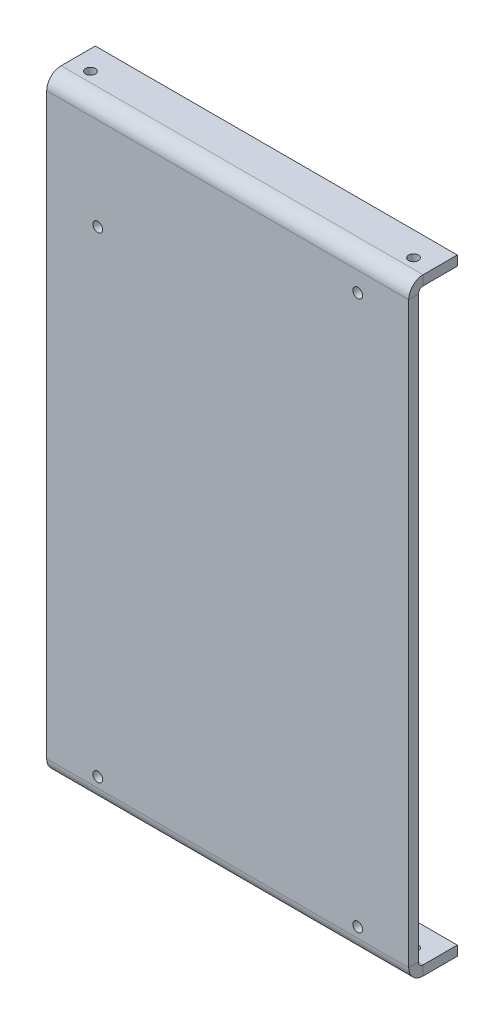
ISO-10303-21;
HEADER;
FILE_DESCRIPTION(('STEP AP214'),'2;1');
FILE_NAME('part.step','',(''),(''),'','','');
FILE_SCHEMA(('AUTOMOTIVE_DESIGN { 1 0 10303 214 1 1 1 1 }'));
ENDSEC;
DATA;
#1=APPLICATION_CONTEXT('core data for automotive mechanical design processes');
#2=APPLICATION_PROTOCOL_DEFINITION('international standard','automotive_design',2000,#1);
#3=PRODUCT_CONTEXT('',#1,'mechanical');
#4=PRODUCT('Part','Part','',(#3));
#5=PRODUCT_RELATED_PRODUCT_CATEGORY('part','',(#4));
#6=PRODUCT_DEFINITION_FORMATION('','',#4);
#7=PRODUCT_DEFINITION_CONTEXT('part definition',#1,'design');
#8=PRODUCT_DEFINITION('design','',#6,#7);
#9=PRODUCT_DEFINITION_SHAPE('','',#8);
#10=(LENGTH_UNIT() NAMED_UNIT(*) SI_UNIT(.MILLI.,.METRE.));
#11=(NAMED_UNIT(*) PLANE_ANGLE_UNIT() SI_UNIT($,.RADIAN.));
#12=(NAMED_UNIT(*) SI_UNIT($,.STERADIAN.) SOLID_ANGLE_UNIT());
#13=UNCERTAINTY_MEASURE_WITH_UNIT(LENGTH_MEASURE(1.E-05),#10,'distance_accuracy_value','');
#14=(GEOMETRIC_REPRESENTATION_CONTEXT(3) GLOBAL_UNCERTAINTY_ASSIGNED_CONTEXT((#13)) GLOBAL_UNIT_ASSIGNED_CONTEXT((#10,
#11,#12)) REPRESENTATION_CONTEXT('',''));
#15=CARTESIAN_POINT('',(0.,0.,0.));
#16=DIRECTION('',(0.,0.,1.));
#17=DIRECTION('',(1.,0.,0.));
#18=AXIS2_PLACEMENT_3D('',#15,#16,#17);
#19=CARTESIAN_POINT('',(0.,0.,-2.));
#20=DIRECTION('',(0.,0.,1.));
#21=DIRECTION('',(1.,0.,0.));
#22=AXIS2_PLACEMENT_3D('',#19,#20,#21);
#23=PLANE('',#22);
#24=CARTESIAN_POINT('',(-53.5,-15.,-2.));
#25=DIRECTION('',(0.,0.,1.));
#26=DIRECTION('',(1.,0.,0.));
#27=AXIS2_PLACEMENT_3D('',#24,#25,#26);
#28=CIRCLE('',#27,1.);
#29=CARTESIAN_POINT('',(-52.5,-15.,-2.));
#30=VERTEX_POINT('',#29);
#31=EDGE_CURVE('E284',#30,#30,#28,.T.);
#32=ORIENTED_EDGE('',*,*,#31,.T.);
#33=EDGE_LOOP('',(#32));
#34=FACE_BOUND('',#33,.T.);
#35=CARTESIAN_POINT('',(-53.5,-113.,-2.));
#36=DIRECTION('',(0.,0.,1.));
#37=DIRECTION('',(1.,0.,0.));
#38=AXIS2_PLACEMENT_3D('',#35,#36,#37);
#39=CIRCLE('',#38,0.999999999999998);
#40=CARTESIAN_POINT('',(-52.5,-113.,-2.));
#41=VERTEX_POINT('',#40);
#42=EDGE_CURVE('E293',#41,#41,#39,.T.);
#43=ORIENTED_EDGE('',*,*,#42,.T.);
#44=EDGE_LOOP('',(#43));
#45=FACE_BOUND('',#44,.T.);
#46=CARTESIAN_POINT('',(0.,-113.,-2.));
#47=DIRECTION('',(0.,0.,1.));
#48=DIRECTION('',(1.,0.,0.));
#49=AXIS2_PLACEMENT_3D('',#46,#47,#48);
#50=CIRCLE('',#49,0.999999999999998);
#51=CARTESIAN_POINT('',(0.999999999999998,-113.,-2.));
#52=VERTEX_POINT('',#51);
#53=EDGE_CURVE('E300',#52,#52,#50,.T.);
#54=ORIENTED_EDGE('',*,*,#53,.T.);
#55=EDGE_LOOP('',(#54));
#56=FACE_BOUND('',#55,.T.);
#57=CARTESIAN_POINT('',(0.,0.,-2.));
#58=DIRECTION('',(0.,0.,1.));
#59=DIRECTION('',(1.,0.,0.));
#60=AXIS2_PLACEMENT_3D('',#57,#58,#59);
#61=CIRCLE('',#60,1.);
#62=CARTESIAN_POINT('',(1.,0.,-2.));
#63=VERTEX_POINT('',#62);
#64=EDGE_CURVE('E303',#63,#63,#61,.T.);
#65=ORIENTED_EDGE('',*,*,#64,.T.);
#66=EDGE_LOOP('',(#65));
#67=FACE_BOUND('',#66,.T.);
#68=DIRECTION('',(1.,0.,0.));
#69=VECTOR('',#68,1.);
#70=CARTESIAN_POINT('',(10.5,4.03479999999999,-2.));
#71=LINE('',#70,#69);
#72=CARTESIAN_POINT('',(10.5,4.03479999999999,-2.));
#73=VERTEX_POINT('',#72);
#74=CARTESIAN_POINT('',(-64.,4.03479999999999,-2.00000000000001));
#75=VERTEX_POINT('',#74);
#76=EDGE_CURVE('E226',#73,#75,#71,.F.);
#77=ORIENTED_EDGE('',*,*,#76,.F.);
#78=DIRECTION('',(0.,1.,0.));
#79=VECTOR('',#78,1.);
#80=CARTESIAN_POINT('',(10.5,-118.,-2.));
#81=LINE('',#80,#79);
#82=CARTESIAN_POINT('',(10.5,-115.0348,-2.00000000000001));
#83=VERTEX_POINT('',#82);
#84=EDGE_CURVE('E95',#83,#73,#81,.T.);
#85=ORIENTED_EDGE('',*,*,#84,.F.);
#86=DIRECTION('',(-1.,0.,0.));
#87=VECTOR('',#86,1.);
#88=CARTESIAN_POINT('',(-64.,-115.0348,-2.00000000000001));
#89=LINE('',#88,#87);
#90=CARTESIAN_POINT('',(-64.,-115.0348,-2.00000000000001));
#91=VERTEX_POINT('',#90);
#92=EDGE_CURVE('E277',#91,#83,#89,.F.);
#93=ORIENTED_EDGE('',*,*,#92,.F.);
#94=DIRECTION('',(0.,-1.,0.));
#95=VECTOR('',#94,1.);
#96=CARTESIAN_POINT('',(-64.,-118.,-2.));
#97=LINE('',#96,#95);
#98=EDGE_CURVE('E13',#75,#91,#97,.T.);
#99=ORIENTED_EDGE('',*,*,#98,.F.);
#100=EDGE_LOOP('',(#77,#85,#93,#99));
#101=FACE_BOUND('',#100,.T.);
#102=ADVANCED_FACE('F84',(#34,#45,#56,#67,#101),#23,.F.);
#103=CARTESIAN_POINT('',(0.,0.,0.));
#104=DIRECTION('',(0.,0.,1.));
#105=DIRECTION('',(1.,0.,0.));
#106=AXIS2_PLACEMENT_3D('',#103,#104,#105);
#107=PLANE('',#106);
#108=CARTESIAN_POINT('',(-53.5,-15.,0.));
#109=DIRECTION('',(0.,0.,1.));
#110=DIRECTION('',(1.,0.,0.));
#111=AXIS2_PLACEMENT_3D('',#108,#109,#110);
#112=CIRCLE('',#111,1.);
#113=CARTESIAN_POINT('',(-52.5,-15.,0.));
#114=VERTEX_POINT('',#113);
#115=EDGE_CURVE('E285',#114,#114,#112,.T.);
#116=ORIENTED_EDGE('',*,*,#115,.F.);
#117=EDGE_LOOP('',(#116));
#118=FACE_BOUND('',#117,.T.);
#119=CARTESIAN_POINT('',(-53.5,-113.,0.));
#120=DIRECTION('',(0.,0.,1.));
#121=DIRECTION('',(1.,0.,0.));
#122=AXIS2_PLACEMENT_3D('',#119,#120,#121);
#123=CIRCLE('',#122,0.999999999999998);
#124=CARTESIAN_POINT('',(-52.5,-113.,0.));
#125=VERTEX_POINT('',#124);
#126=EDGE_CURVE('E289',#125,#125,#123,.T.);
#127=ORIENTED_EDGE('',*,*,#126,.F.);
#128=EDGE_LOOP('',(#127));
#129=FACE_BOUND('',#128,.T.);
#130=CARTESIAN_POINT('',(0.,-113.,0.));
#131=DIRECTION('',(0.,0.,1.));
#132=DIRECTION('',(1.,0.,0.));
#133=AXIS2_PLACEMENT_3D('',#130,#131,#132);
#134=CIRCLE('',#133,0.999999999999998);
#135=CARTESIAN_POINT('',(0.999999999999998,-113.,0.));
#136=VERTEX_POINT('',#135);
#137=EDGE_CURVE('E295',#136,#136,#134,.T.);
#138=ORIENTED_EDGE('',*,*,#137,.F.);
#139=EDGE_LOOP('',(#138));
#140=FACE_BOUND('',#139,.T.);
#141=CARTESIAN_POINT('',(0.,0.,0.));
#142=DIRECTION('',(0.,0.,1.));
#143=DIRECTION('',(1.,0.,0.));
#144=AXIS2_PLACEMENT_3D('',#141,#142,#143);
#145=CIRCLE('',#144,1.);
#146=CARTESIAN_POINT('',(1.,0.,0.));
#147=VERTEX_POINT('',#146);
#148=EDGE_CURVE('E297',#147,#147,#145,.T.);
#149=ORIENTED_EDGE('',*,*,#148,.F.);
#150=EDGE_LOOP('',(#149));
#151=FACE_BOUND('',#150,.T.);
#152=DIRECTION('',(0.,1.,0.));
#153=VECTOR('',#152,1.);
#154=CARTESIAN_POINT('',(10.5,-118.,0.));
#155=LINE('',#154,#153);
#156=CARTESIAN_POINT('',(10.5,-115.0348,0.));
#157=VERTEX_POINT('',#156);
#158=CARTESIAN_POINT('',(10.5,4.0348,0.));
#159=VERTEX_POINT('',#158);
#160=EDGE_CURVE('E306',#157,#159,#155,.T.);
#161=ORIENTED_EDGE('',*,*,#160,.T.);
#162=DIRECTION('',(1.,0.,0.));
#163=VECTOR('',#162,1.);
#164=CARTESIAN_POINT('',(10.5,4.0348,0.));
#165=LINE('',#164,#163);
#166=CARTESIAN_POINT('',(-64.,4.03479999999999,0.));
#167=VERTEX_POINT('',#166);
#168=EDGE_CURVE('E178',#159,#167,#165,.F.);
#169=ORIENTED_EDGE('',*,*,#168,.T.);
#170=DIRECTION('',(0.,-1.,0.));
#171=VECTOR('',#170,1.);
#172=CARTESIAN_POINT('',(-64.,-118.,0.));
#173=LINE('',#172,#171);
#174=CARTESIAN_POINT('',(-64.,-115.0348,0.));
#175=VERTEX_POINT('',#174);
#176=EDGE_CURVE('E309',#167,#175,#173,.T.);
#177=ORIENTED_EDGE('',*,*,#176,.T.);
#178=DIRECTION('',(-1.,0.,0.));
#179=VECTOR('',#178,1.);
#180=CARTESIAN_POINT('',(-64.,-115.0348,0.));
#181=LINE('',#180,#179);
#182=EDGE_CURVE('E261',#175,#157,#181,.F.);
#183=ORIENTED_EDGE('',*,*,#182,.T.);
#184=EDGE_LOOP('',(#161,#169,#177,#183));
#185=FACE_BOUND('',#184,.T.);
#186=ADVANCED_FACE('F376',(#118,#129,#140,#151,#185),#107,.T.);
#187=CARTESIAN_POINT('',(10.5,-118.,-2.));
#188=DIRECTION('',(1.,0.,0.));
#189=DIRECTION('',(0.,1.,0.));
#190=AXIS2_PLACEMENT_3D('',#187,#188,#189);
#191=PLANE('',#190);
#192=ORIENTED_EDGE('',*,*,#84,.T.);
#193=DIRECTION('',(0.,0.,1.));
#194=VECTOR('',#193,1.);
#195=CARTESIAN_POINT('',(10.5,4.03479999999999,-2.));
#196=LINE('',#195,#194);
#197=EDGE_CURVE('E221',#73,#159,#196,.T.);
#198=ORIENTED_EDGE('',*,*,#197,.T.);
#199=ORIENTED_EDGE('',*,*,#160,.F.);
#200=DIRECTION('',(0.,0.,1.));
#201=VECTOR('',#200,1.);
#202=CARTESIAN_POINT('',(10.5,-115.0348,-2.00000000000001));
#203=LINE('',#202,#201);
#204=EDGE_CURVE('E278',#83,#157,#203,.T.);
#205=ORIENTED_EDGE('',*,*,#204,.F.);
#206=EDGE_LOOP('',(#192,#198,#199,#205));
#207=FACE_BOUND('',#206,.T.);
#208=ADVANCED_FACE('F83',(#207),#191,.T.);
#209=CARTESIAN_POINT('',(-64.,-118.,-2.));
#210=DIRECTION('',(-1.,0.,0.));
#211=DIRECTION('',(0.,0.,1.));
#212=AXIS2_PLACEMENT_3D('',#209,#210,#211);
#213=PLANE('',#212);
#214=DIRECTION('',(0.,0.,1.));
#215=VECTOR('',#214,1.);
#216=CARTESIAN_POINT('',(-64.,4.03479999999999,-2.00000000000001));
#217=LINE('',#216,#215);
#218=EDGE_CURVE('E233',#75,#167,#217,.T.);
#219=ORIENTED_EDGE('',*,*,#218,.F.);
#220=ORIENTED_EDGE('',*,*,#98,.T.);
#221=DIRECTION('',(0.,0.,1.));
#222=VECTOR('',#221,1.);
#223=CARTESIAN_POINT('',(-64.,-115.0348,-2.00000000000001));
#224=LINE('',#223,#222);
#225=EDGE_CURVE('E268',#91,#175,#224,.T.);
#226=ORIENTED_EDGE('',*,*,#225,.T.);
#227=ORIENTED_EDGE('',*,*,#176,.F.);
#228=EDGE_LOOP('',(#219,#220,#226,#227));
#229=FACE_BOUND('',#228,.T.);
#230=ADVANCED_FACE('F363',(#229),#213,.T.);
#231=CARTESIAN_POINT('',(0.,0.,-2.));
#232=DIRECTION('',(0.,0.,1.));
#233=DIRECTION('',(1.,0.,0.));
#234=AXIS2_PLACEMENT_3D('',#231,#232,#233);
#235=CYLINDRICAL_SURFACE('',#234,1.);
#236=ORIENTED_EDGE('',*,*,#64,.F.);
#237=EDGE_LOOP('',(#236));
#238=FACE_BOUND('',#237,.T.);
#239=ORIENTED_EDGE('',*,*,#148,.T.);
#240=EDGE_LOOP('',(#239));
#241=FACE_BOUND('',#240,.T.);
#242=ADVANCED_FACE('F424',(#238,#241),#235,.F.);
#243=CARTESIAN_POINT('',(0.,-113.,-2.));
#244=DIRECTION('',(0.,0.,1.));
#245=DIRECTION('',(1.,0.,0.));
#246=AXIS2_PLACEMENT_3D('',#243,#244,#245);
#247=CYLINDRICAL_SURFACE('',#246,0.999999999999998);
#248=ORIENTED_EDGE('',*,*,#53,.F.);
#249=EDGE_LOOP('',(#248));
#250=FACE_BOUND('',#249,.T.);
#251=ORIENTED_EDGE('',*,*,#137,.T.);
#252=EDGE_LOOP('',(#251));
#253=FACE_BOUND('',#252,.T.);
#254=ADVANCED_FACE('F433',(#250,#253),#247,.F.);
#255=CARTESIAN_POINT('',(-53.5,-113.,-2.));
#256=DIRECTION('',(0.,0.,1.));
#257=DIRECTION('',(1.,0.,0.));
#258=AXIS2_PLACEMENT_3D('',#255,#256,#257);
#259=CYLINDRICAL_SURFACE('',#258,0.999999999999998);
#260=ORIENTED_EDGE('',*,*,#42,.F.);
#261=EDGE_LOOP('',(#260));
#262=FACE_BOUND('',#261,.T.);
#263=ORIENTED_EDGE('',*,*,#126,.T.);
#264=EDGE_LOOP('',(#263));
#265=FACE_BOUND('',#264,.T.);
#266=ADVANCED_FACE('F689',(#262,#265),#259,.F.);
#267=CARTESIAN_POINT('',(-53.5,-15.,-2.));
#268=DIRECTION('',(0.,0.,1.));
#269=DIRECTION('',(1.,0.,0.));
#270=AXIS2_PLACEMENT_3D('',#267,#268,#269);
#271=CYLINDRICAL_SURFACE('',#270,1.);
#272=ORIENTED_EDGE('',*,*,#31,.F.);
#273=EDGE_LOOP('',(#272));
#274=FACE_BOUND('',#273,.T.);
#275=ORIENTED_EDGE('',*,*,#115,.T.);
#276=EDGE_LOOP('',(#275));
#277=FACE_BOUND('',#276,.T.);
#278=ADVANCED_FACE('F456',(#274,#277),#271,.F.);
#279=CARTESIAN_POINT('',(10.5,-115.0348,-2.9652));
#280=DIRECTION('',(1.,0.,0.));
#281=DIRECTION('',(0.,0.,-1.));
#282=AXIS2_PLACEMENT_3D('',#279,#280,#281);
#283=PLANE('',#282);
#284=DIRECTION('',(0.,1.,0.));
#285=VECTOR('',#284,1.);
#286=CARTESIAN_POINT('',(10.5,-118.,-2.96519999999999));
#287=LINE('',#286,#285);
#288=CARTESIAN_POINT('',(10.5,-116.,-2.9652));
#289=VERTEX_POINT('',#288);
#290=CARTESIAN_POINT('',(10.5,-118.,-2.96519999999999));
#291=VERTEX_POINT('',#290);
#292=EDGE_CURVE('E231',#289,#291,#287,.F.);
#293=ORIENTED_EDGE('',*,*,#292,.F.);
#294=CARTESIAN_POINT('',(10.5,-115.0348,-2.9652));
#295=DIRECTION('',(-1.,0.,0.));
#296=DIRECTION('',(0.,0.,1.));
#297=AXIS2_PLACEMENT_3D('',#294,#295,#296);
#298=CIRCLE('',#297,0.965199999999999);
#299=EDGE_CURVE('E271',#83,#289,#298,.F.);
#300=ORIENTED_EDGE('',*,*,#299,.F.);
#301=ORIENTED_EDGE('',*,*,#204,.T.);
#302=CARTESIAN_POINT('',(10.5,-115.0348,-2.9652));
#303=DIRECTION('',(-1.,0.,0.));
#304=DIRECTION('',(0.,0.,1.));
#305=AXIS2_PLACEMENT_3D('',#302,#303,#304);
#306=CIRCLE('',#305,2.9652);
#307=EDGE_CURVE('E99',#157,#291,#306,.F.);
#308=ORIENTED_EDGE('',*,*,#307,.T.);
#309=EDGE_LOOP('',(#293,#300,#301,#308));
#310=FACE_BOUND('',#309,.T.);
#311=ADVANCED_FACE('F375',(#310),#283,.T.);
#312=CARTESIAN_POINT('',(-64.,-115.0348,-2.9652));
#313=DIRECTION('',(1.,0.,0.));
#314=DIRECTION('',(0.,0.,-1.));
#315=AXIS2_PLACEMENT_3D('',#312,#313,#314);
#316=PLANE('',#315);
#317=CARTESIAN_POINT('',(-64.,-115.0348,-2.9652));
#318=DIRECTION('',(-1.,0.,0.));
#319=DIRECTION('',(0.,0.,1.));
#320=AXIS2_PLACEMENT_3D('',#317,#318,#319);
#321=CIRCLE('',#320,0.965199999999999);
#322=CARTESIAN_POINT('',(-64.,-116.,-2.9652));
#323=VERTEX_POINT('',#322);
#324=EDGE_CURVE('E238',#323,#91,#321,.T.);
#325=ORIENTED_EDGE('',*,*,#324,.F.);
#326=DIRECTION('',(0.,1.,0.));
#327=VECTOR('',#326,1.);
#328=CARTESIAN_POINT('',(-64.,-116.,-2.9652));
#329=LINE('',#328,#327);
#330=CARTESIAN_POINT('',(-64.,-118.,-2.96519999999999));
#331=VERTEX_POINT('',#330);
#332=EDGE_CURVE('E259',#323,#331,#329,.F.);
#333=ORIENTED_EDGE('',*,*,#332,.T.);
#334=CARTESIAN_POINT('',(-64.,-115.0348,-2.9652));
#335=DIRECTION('',(-1.,0.,0.));
#336=DIRECTION('',(0.,0.,1.));
#337=AXIS2_PLACEMENT_3D('',#334,#335,#336);
#338=CIRCLE('',#337,2.9652);
#339=EDGE_CURVE('E270',#331,#175,#338,.T.);
#340=ORIENTED_EDGE('',*,*,#339,.T.);
#341=ORIENTED_EDGE('',*,*,#225,.F.);
#342=EDGE_LOOP('',(#325,#333,#340,#341));
#343=FACE_BOUND('',#342,.T.);
#344=ADVANCED_FACE('F378',(#343),#316,.F.);
#345=CARTESIAN_POINT('',(-64.,-115.0348,-2.9652));
#346=DIRECTION('',(-1.,0.,0.));
#347=DIRECTION('',(0.,-1.,0.));
#348=AXIS2_PLACEMENT_3D('',#345,#346,#347);
#349=CYLINDRICAL_SURFACE('',#348,2.9652);
#350=ORIENTED_EDGE('',*,*,#182,.F.);
#351=ORIENTED_EDGE('',*,*,#339,.F.);
#352=DIRECTION('',(-1.,0.,0.));
#353=VECTOR('',#352,1.);
#354=CARTESIAN_POINT('',(10.5,-118.,-2.96519999999999));
#355=LINE('',#354,#353);
#356=EDGE_CURVE('E257',#331,#291,#355,.F.);
#357=ORIENTED_EDGE('',*,*,#356,.T.);
#358=ORIENTED_EDGE('',*,*,#307,.F.);
#359=EDGE_LOOP('',(#350,#351,#357,#358));
#360=FACE_BOUND('',#359,.T.);
#361=ADVANCED_FACE('F380',(#360),#349,.T.);
#362=CARTESIAN_POINT('',(-64.,-115.0348,-2.9652));
#363=DIRECTION('',(-1.,0.,0.));
#364=DIRECTION('',(0.,-1.,0.));
#365=AXIS2_PLACEMENT_3D('',#362,#363,#364);
#366=CYLINDRICAL_SURFACE('',#365,0.965199999999999);
#367=ORIENTED_EDGE('',*,*,#92,.T.);
#368=ORIENTED_EDGE('',*,*,#299,.T.);
#369=DIRECTION('',(-1.,0.,0.));
#370=VECTOR('',#369,1.);
#371=CARTESIAN_POINT('',(10.5,-116.,-2.9652));
#372=LINE('',#371,#370);
#373=EDGE_CURVE('E262',#289,#323,#372,.T.);
#374=ORIENTED_EDGE('',*,*,#373,.T.);
#375=ORIENTED_EDGE('',*,*,#324,.T.);
#376=EDGE_LOOP('',(#367,#368,#374,#375));
#377=FACE_BOUND('',#376,.T.);
#378=ADVANCED_FACE('F370',(#377),#366,.F.);
#379=CARTESIAN_POINT('',(-64.,-118.,-10.));
#380=DIRECTION('',(1.,0.,0.));
#381=DIRECTION('',(0.,1.,0.));
#382=AXIS2_PLACEMENT_3D('',#379,#380,#381);
#383=PLANE('',#382);
#384=ORIENTED_EDGE('',*,*,#332,.F.);
#385=DIRECTION('',(0.,0.,1.));
#386=VECTOR('',#385,1.);
#387=CARTESIAN_POINT('',(-64.,-116.,-10.));
#388=LINE('',#387,#386);
#389=CARTESIAN_POINT('',(-64.,-116.,-10.));
#390=VERTEX_POINT('',#389);
#391=EDGE_CURVE('E251',#323,#390,#388,.F.);
#392=ORIENTED_EDGE('',*,*,#391,.T.);
#393=DIRECTION('',(0.,1.,0.));
#394=VECTOR('',#393,1.);
#395=CARTESIAN_POINT('',(-64.,-118.,-10.));
#396=LINE('',#395,#394);
#397=CARTESIAN_POINT('',(-64.,-118.,-10.));
#398=VERTEX_POINT('',#397);
#399=EDGE_CURVE('E232',#398,#390,#396,.T.);
#400=ORIENTED_EDGE('',*,*,#399,.F.);
#401=DIRECTION('',(0.,0.,-1.));
#402=VECTOR('',#401,1.);
#403=CARTESIAN_POINT('',(-64.,-118.,4.16377703008212E-13));
#404=LINE('',#403,#402);
#405=EDGE_CURVE('E250',#331,#398,#404,.T.);
#406=ORIENTED_EDGE('',*,*,#405,.F.);
#407=EDGE_LOOP('',(#384,#392,#400,#406));
#408=FACE_BOUND('',#407,.T.);
#409=ADVANCED_FACE('F388',(#408),#383,.F.);
#410=CARTESIAN_POINT('',(10.5,-118.,-1.99999999999999));
#411=DIRECTION('',(-1.,0.,0.));
#412=DIRECTION('',(0.,-1.,0.));
#413=AXIS2_PLACEMENT_3D('',#410,#411,#412);
#414=PLANE('',#413);
#415=ORIENTED_EDGE('',*,*,#292,.T.);
#416=DIRECTION('',(0.,0.,1.));
#417=VECTOR('',#416,1.);
#418=CARTESIAN_POINT('',(10.5,-118.,4.16377703008212E-13));
#419=LINE('',#418,#417);
#420=CARTESIAN_POINT('',(10.5,-118.,-10.));
#421=VERTEX_POINT('',#420);
#422=EDGE_CURVE('E245',#421,#291,#419,.T.);
#423=ORIENTED_EDGE('',*,*,#422,.F.);
#424=DIRECTION('',(0.,1.,0.));
#425=VECTOR('',#424,1.);
#426=CARTESIAN_POINT('',(10.5,-118.,-10.));
#427=LINE('',#426,#425);
#428=CARTESIAN_POINT('',(10.5,-116.,-10.));
#429=VERTEX_POINT('',#428);
#430=EDGE_CURVE('E237',#421,#429,#427,.T.);
#431=ORIENTED_EDGE('',*,*,#430,.T.);
#432=DIRECTION('',(0.,0.,-1.));
#433=VECTOR('',#432,1.);
#434=CARTESIAN_POINT('',(10.5,-116.,-2.));
#435=LINE('',#434,#433);
#436=EDGE_CURVE('E248',#429,#289,#435,.F.);
#437=ORIENTED_EDGE('',*,*,#436,.T.);
#438=EDGE_LOOP('',(#415,#423,#431,#437));
#439=FACE_BOUND('',#438,.T.);
#440=ADVANCED_FACE('F399',(#439),#414,.F.);
#441=CARTESIAN_POINT('',(0.,-118.,4.16377703008212E-13));
#442=DIRECTION('',(0.,1.,0.));
#443=DIRECTION('',(0.,0.,1.));
#444=AXIS2_PLACEMENT_3D('',#441,#442,#443);
#445=PLANE('',#444);
#446=CARTESIAN_POINT('',(-60.,-118.,-4.99999999999987));
#447=DIRECTION('',(0.,-1.,0.));
#448=DIRECTION('',(0.,0.,-1.));
#449=AXIS2_PLACEMENT_3D('',#446,#447,#448);
#450=CIRCLE('',#449,0.999999999999998);
#451=CARTESIAN_POINT('',(-60.,-118.,-5.99999999999987));
#452=VERTEX_POINT('',#451);
#453=EDGE_CURVE('E321',#452,#452,#450,.T.);
#454=ORIENTED_EDGE('',*,*,#453,.F.);
#455=EDGE_LOOP('',(#454));
#456=FACE_BOUND('',#455,.T.);
#457=CARTESIAN_POINT('',(6.5,-118.,-4.99999999999987));
#458=DIRECTION('',(0.,-1.,0.));
#459=DIRECTION('',(0.,0.,-1.));
#460=AXIS2_PLACEMENT_3D('',#457,#458,#459);
#461=CIRCLE('',#460,1.);
#462=CARTESIAN_POINT('',(6.5,-118.,-5.99999999999987));
#463=VERTEX_POINT('',#462);
#464=EDGE_CURVE('E329',#463,#463,#461,.T.);
#465=ORIENTED_EDGE('',*,*,#464,.F.);
#466=EDGE_LOOP('',(#465));
#467=FACE_BOUND('',#466,.T.);
#468=ORIENTED_EDGE('',*,*,#356,.F.);
#469=ORIENTED_EDGE('',*,*,#405,.T.);
#470=DIRECTION('',(1.,0.,0.));
#471=VECTOR('',#470,1.);
#472=CARTESIAN_POINT('',(0.,-118.,-10.));
#473=LINE('',#472,#471);
#474=EDGE_CURVE('E244',#398,#421,#473,.T.);
#475=ORIENTED_EDGE('',*,*,#474,.T.);
#476=ORIENTED_EDGE('',*,*,#422,.T.);
#477=EDGE_LOOP('',(#468,#469,#475,#476));
#478=FACE_BOUND('',#477,.T.);
#479=ADVANCED_FACE('F387',(#456,#467,#478),#445,.F.);
#480=CARTESIAN_POINT('',(0.,-116.,4.09394740330526E-13));
#481=DIRECTION('',(0.,1.,0.));
#482=DIRECTION('',(0.,0.,1.));
#483=AXIS2_PLACEMENT_3D('',#480,#481,#482);
#484=PLANE('',#483);
#485=CARTESIAN_POINT('',(-60.,-116.,-4.99999999999988));
#486=DIRECTION('',(0.,1.,0.));
#487=DIRECTION('',(0.,0.,1.));
#488=AXIS2_PLACEMENT_3D('',#485,#486,#487);
#489=CIRCLE('',#488,0.999999999999998);
#490=CARTESIAN_POINT('',(-60.,-116.,-3.99999999999988));
#491=VERTEX_POINT('',#490);
#492=EDGE_CURVE('E225',#491,#491,#489,.T.);
#493=ORIENTED_EDGE('',*,*,#492,.F.);
#494=EDGE_LOOP('',(#493));
#495=FACE_BOUND('',#494,.T.);
#496=CARTESIAN_POINT('',(6.5,-116.,-4.99999999999988));
#497=DIRECTION('',(0.,1.,0.));
#498=DIRECTION('',(0.,0.,1.));
#499=AXIS2_PLACEMENT_3D('',#496,#497,#498);
#500=CIRCLE('',#499,1.);
#501=CARTESIAN_POINT('',(6.5,-116.,-3.99999999999988));
#502=VERTEX_POINT('',#501);
#503=EDGE_CURVE('E320',#502,#502,#500,.T.);
#504=ORIENTED_EDGE('',*,*,#503,.F.);
#505=EDGE_LOOP('',(#504));
#506=FACE_BOUND('',#505,.T.);
#507=ORIENTED_EDGE('',*,*,#391,.F.);
#508=ORIENTED_EDGE('',*,*,#373,.F.);
#509=ORIENTED_EDGE('',*,*,#436,.F.);
#510=DIRECTION('',(-1.,0.,0.));
#511=VECTOR('',#510,1.);
#512=CARTESIAN_POINT('',(10.5,-116.,-10.));
#513=LINE('',#512,#511);
#514=EDGE_CURVE('E255',#390,#429,#513,.F.);
#515=ORIENTED_EDGE('',*,*,#514,.F.);
#516=EDGE_LOOP('',(#507,#508,#509,#515));
#517=FACE_BOUND('',#516,.T.);
#518=ADVANCED_FACE('F396',(#495,#506,#517),#484,.T.);
#519=CARTESIAN_POINT('',(10.5,-118.,-10.));
#520=DIRECTION('',(0.,0.,1.));
#521=DIRECTION('',(0.,-1.,0.));
#522=AXIS2_PLACEMENT_3D('',#519,#520,#521);
#523=PLANE('',#522);
#524=ORIENTED_EDGE('',*,*,#514,.T.);
#525=ORIENTED_EDGE('',*,*,#430,.F.);
#526=ORIENTED_EDGE('',*,*,#474,.F.);
#527=ORIENTED_EDGE('',*,*,#399,.T.);
#528=EDGE_LOOP('',(#524,#525,#526,#527));
#529=FACE_BOUND('',#528,.T.);
#530=ADVANCED_FACE('F393',(#529),#523,.F.);
#531=CARTESIAN_POINT('',(-64.,4.03479999999999,-2.96520000000001));
#532=DIRECTION('',(-1.,0.,0.));
#533=DIRECTION('',(0.,0.,1.));
#534=AXIS2_PLACEMENT_3D('',#531,#532,#533);
#535=PLANE('',#534);
#536=DIRECTION('',(0.,-1.,0.));
#537=VECTOR('',#536,1.);
#538=CARTESIAN_POINT('',(-64.,6.99999999999998,-2.96519999999999));
#539=LINE('',#538,#537);
#540=CARTESIAN_POINT('',(-64.,4.99999999999998,-2.9652));
#541=VERTEX_POINT('',#540);
#542=CARTESIAN_POINT('',(-64.,6.99999999999998,-2.9652));
#543=VERTEX_POINT('',#542);
#544=EDGE_CURVE('E217',#541,#543,#539,.F.);
#545=ORIENTED_EDGE('',*,*,#544,.F.);
#546=CARTESIAN_POINT('',(-64.,4.03479999999999,-2.96520000000001));
#547=DIRECTION('',(1.,0.,0.));
#548=DIRECTION('',(0.,0.,-1.));
#549=AXIS2_PLACEMENT_3D('',#546,#547,#548);
#550=CIRCLE('',#549,0.965199999999995);
#551=EDGE_CURVE('E181',#75,#541,#550,.F.);
#552=ORIENTED_EDGE('',*,*,#551,.F.);
#553=ORIENTED_EDGE('',*,*,#218,.T.);
#554=CARTESIAN_POINT('',(-64.,4.03479999999999,-2.96520000000001));
#555=DIRECTION('',(1.,0.,0.));
#556=DIRECTION('',(0.,0.,-1.));
#557=AXIS2_PLACEMENT_3D('',#554,#555,#556);
#558=CIRCLE('',#557,2.96519999999999);
#559=EDGE_CURVE('E108',#167,#543,#558,.F.);
#560=ORIENTED_EDGE('',*,*,#559,.T.);
#561=EDGE_LOOP('',(#545,#552,#553,#560));
#562=FACE_BOUND('',#561,.T.);
#563=ADVANCED_FACE('F357',(#562),#535,.T.);
#564=CARTESIAN_POINT('',(10.5,4.03479999999999,-2.96519999999999));
#565=DIRECTION('',(-1.,0.,0.));
#566=DIRECTION('',(0.,0.,1.));
#567=AXIS2_PLACEMENT_3D('',#564,#565,#566);
#568=PLANE('',#567);
#569=CARTESIAN_POINT('',(10.5,4.03479999999999,-2.96519999999999));
#570=DIRECTION('',(1.,0.,0.));
#571=DIRECTION('',(0.,0.,-1.));
#572=AXIS2_PLACEMENT_3D('',#569,#570,#571);
#573=CIRCLE('',#572,0.965199999999995);
#574=CARTESIAN_POINT('',(10.5,4.99999999999998,-2.96519999999999));
#575=VERTEX_POINT('',#574);
#576=EDGE_CURVE('E189',#575,#73,#573,.T.);
#577=ORIENTED_EDGE('',*,*,#576,.F.);
#578=DIRECTION('',(0.,-1.,0.));
#579=VECTOR('',#578,1.);
#580=CARTESIAN_POINT('',(10.5,4.99999999999999,-2.96519999999999));
#581=LINE('',#580,#579);
#582=CARTESIAN_POINT('',(10.5,6.99999999999999,-2.96519999999999));
#583=VERTEX_POINT('',#582);
#584=EDGE_CURVE('E184',#575,#583,#581,.F.);
#585=ORIENTED_EDGE('',*,*,#584,.T.);
#586=CARTESIAN_POINT('',(10.5,4.03479999999999,-2.96519999999999));
#587=DIRECTION('',(1.,0.,0.));
#588=DIRECTION('',(0.,0.,-1.));
#589=AXIS2_PLACEMENT_3D('',#586,#587,#588);
#590=CIRCLE('',#589,2.96519999999999);
#591=EDGE_CURVE('E175',#583,#159,#590,.T.);
#592=ORIENTED_EDGE('',*,*,#591,.T.);
#593=ORIENTED_EDGE('',*,*,#197,.F.);
#594=EDGE_LOOP('',(#577,#585,#592,#593));
#595=FACE_BOUND('',#594,.T.);
#596=ADVANCED_FACE('F187',(#595),#568,.F.);
#597=CARTESIAN_POINT('',(10.5,4.03479999999999,-2.96519999999999));
#598=DIRECTION('',(1.,0.,0.));
#599=DIRECTION('',(0.,1.,0.));
#600=AXIS2_PLACEMENT_3D('',#597,#598,#599);
#601=CYLINDRICAL_SURFACE('',#600,2.96519999999999);
#602=ORIENTED_EDGE('',*,*,#168,.F.);
#603=ORIENTED_EDGE('',*,*,#591,.F.);
#604=DIRECTION('',(1.,0.,0.));
#605=VECTOR('',#604,1.);
#606=CARTESIAN_POINT('',(0.,6.99999999999999,-2.96519999999999));
#607=LINE('',#606,#605);
#608=EDGE_CURVE('E176',#543,#583,#607,.T.);
#609=ORIENTED_EDGE('',*,*,#608,.F.);
#610=ORIENTED_EDGE('',*,*,#559,.F.);
#611=EDGE_LOOP('',(#602,#603,#609,#610));
#612=FACE_BOUND('',#611,.T.);
#613=ADVANCED_FACE('F172',(#612),#601,.T.);
#614=CARTESIAN_POINT('',(10.5,4.03479999999999,-2.96519999999999));
#615=DIRECTION('',(1.,0.,0.));
#616=DIRECTION('',(0.,1.,0.));
#617=AXIS2_PLACEMENT_3D('',#614,#615,#616);
#618=CYLINDRICAL_SURFACE('',#617,0.965199999999995);
#619=ORIENTED_EDGE('',*,*,#76,.T.);
#620=ORIENTED_EDGE('',*,*,#551,.T.);
#621=DIRECTION('',(-1.,0.,0.));
#622=VECTOR('',#621,1.);
#623=CARTESIAN_POINT('',(-64.,4.99999999999998,-2.9652));
#624=LINE('',#623,#622);
#625=EDGE_CURVE('E195',#541,#575,#624,.F.);
#626=ORIENTED_EDGE('',*,*,#625,.T.);
#627=ORIENTED_EDGE('',*,*,#576,.T.);
#628=EDGE_LOOP('',(#619,#620,#626,#627));
#629=FACE_BOUND('',#628,.T.);
#630=ADVANCED_FACE('F355',(#629),#618,.F.);
#631=CARTESIAN_POINT('',(10.5,6.99999999999999,-1.99999999999999));
#632=DIRECTION('',(-1.,0.,0.));
#633=DIRECTION('',(0.,0.,1.));
#634=AXIS2_PLACEMENT_3D('',#631,#632,#633);
#635=PLANE('',#634);
#636=ORIENTED_EDGE('',*,*,#584,.F.);
#637=DIRECTION('',(0.,0.,-1.));
#638=VECTOR('',#637,1.);
#639=CARTESIAN_POINT('',(10.5,4.99999999999999,-2.));
#640=LINE('',#639,#638);
#641=CARTESIAN_POINT('',(10.5,5.00000000000002,-10.));
#642=VERTEX_POINT('',#641);
#643=EDGE_CURVE('E202',#575,#642,#640,.T.);
#644=ORIENTED_EDGE('',*,*,#643,.T.);
#645=DIRECTION('',(0.,-1.,0.));
#646=VECTOR('',#645,1.);
#647=CARTESIAN_POINT('',(10.5,7.00000000000002,-10.));
#648=LINE('',#647,#646);
#649=CARTESIAN_POINT('',(10.5,7.00000000000002,-10.));
#650=VERTEX_POINT('',#649);
#651=EDGE_CURVE('E207',#650,#642,#648,.T.);
#652=ORIENTED_EDGE('',*,*,#651,.F.);
#653=DIRECTION('',(0.,0.,1.));
#654=VECTOR('',#653,1.);
#655=CARTESIAN_POINT('',(10.5,6.99999999999998,0.));
#656=LINE('',#655,#654);
#657=EDGE_CURVE('E200',#583,#650,#656,.F.);
#658=ORIENTED_EDGE('',*,*,#657,.F.);
#659=EDGE_LOOP('',(#636,#644,#652,#658));
#660=FACE_BOUND('',#659,.T.);
#661=ADVANCED_FACE('F201',(#660),#635,.F.);
#662=CARTESIAN_POINT('',(-64.,7.00000000000001,-10.));
#663=DIRECTION('',(1.,0.,0.));
#664=DIRECTION('',(0.,1.,0.));
#665=AXIS2_PLACEMENT_3D('',#662,#663,#664);
#666=PLANE('',#665);
#667=ORIENTED_EDGE('',*,*,#544,.T.);
#668=DIRECTION('',(0.,0.,-1.));
#669=VECTOR('',#668,1.);
#670=CARTESIAN_POINT('',(-64.,6.99999999999997,0.));
#671=LINE('',#670,#669);
#672=CARTESIAN_POINT('',(-64.,7.00000000000001,-10.));
#673=VERTEX_POINT('',#672);
#674=EDGE_CURVE('E196',#673,#543,#671,.F.);
#675=ORIENTED_EDGE('',*,*,#674,.F.);
#676=DIRECTION('',(0.,-1.,0.));
#677=VECTOR('',#676,1.);
#678=CARTESIAN_POINT('',(-64.,7.00000000000001,-10.));
#679=LINE('',#678,#677);
#680=CARTESIAN_POINT('',(-64.,5.00000000000001,-10.));
#681=VERTEX_POINT('',#680);
#682=EDGE_CURVE('E338',#673,#681,#679,.T.);
#683=ORIENTED_EDGE('',*,*,#682,.T.);
#684=DIRECTION('',(0.,0.,1.));
#685=VECTOR('',#684,1.);
#686=CARTESIAN_POINT('',(-64.,5.00000000000001,-10.));
#687=LINE('',#686,#685);
#688=EDGE_CURVE('E206',#681,#541,#687,.T.);
#689=ORIENTED_EDGE('',*,*,#688,.T.);
#690=EDGE_LOOP('',(#667,#675,#683,#689));
#691=FACE_BOUND('',#690,.T.);
#692=ADVANCED_FACE('F343',(#691),#666,.F.);
#693=CARTESIAN_POINT('',(0.,6.99999999999998,0.));
#694=DIRECTION('',(0.,1.,0.));
#695=DIRECTION('',(0.,0.,1.));
#696=AXIS2_PLACEMENT_3D('',#693,#694,#695);
#697=PLANE('',#696);
#698=CARTESIAN_POINT('',(-60.,7.00000000000002,-5.00000000000016));
#699=DIRECTION('',(0.,-1.,0.));
#700=DIRECTION('',(0.,0.,-1.));
#701=AXIS2_PLACEMENT_3D('',#698,#699,#700);
#702=CIRCLE('',#701,0.999999999999998);
#703=CARTESIAN_POINT('',(-60.,7.00000000000002,-6.00000000000016));
#704=VERTEX_POINT('',#703);
#705=EDGE_CURVE('E319',#704,#704,#702,.T.);
#706=ORIENTED_EDGE('',*,*,#705,.T.);
#707=EDGE_LOOP('',(#706));
#708=FACE_BOUND('',#707,.T.);
#709=CARTESIAN_POINT('',(6.49999999999998,7.00000000000003,-5.00000000000016));
#710=DIRECTION('',(0.,-1.,0.));
#711=DIRECTION('',(0.,0.,-1.));
#712=AXIS2_PLACEMENT_3D('',#709,#710,#711);
#713=CIRCLE('',#712,1.);
#714=CARTESIAN_POINT('',(6.49999999999998,7.00000000000003,-6.00000000000016));
#715=VERTEX_POINT('',#714);
#716=EDGE_CURVE('E331',#715,#715,#713,.T.);
#717=ORIENTED_EDGE('',*,*,#716,.T.);
#718=EDGE_LOOP('',(#717));
#719=FACE_BOUND('',#718,.T.);
#720=ORIENTED_EDGE('',*,*,#674,.T.);
#721=ORIENTED_EDGE('',*,*,#608,.T.);
#722=ORIENTED_EDGE('',*,*,#657,.T.);
#723=DIRECTION('',(1.,0.,0.));
#724=VECTOR('',#723,1.);
#725=CARTESIAN_POINT('',(0.,7.00000000000002,-10.));
#726=LINE('',#725,#724);
#727=EDGE_CURVE('E210',#650,#673,#726,.F.);
#728=ORIENTED_EDGE('',*,*,#727,.T.);
#729=EDGE_LOOP('',(#720,#721,#722,#728));
#730=FACE_BOUND('',#729,.T.);
#731=ADVANCED_FACE('F197',(#708,#719,#730),#697,.T.);
#732=CARTESIAN_POINT('',(0.,4.99999999999998,0.));
#733=DIRECTION('',(0.,1.,0.));
#734=DIRECTION('',(0.,0.,1.));
#735=AXIS2_PLACEMENT_3D('',#732,#733,#734);
#736=PLANE('',#735);
#737=CARTESIAN_POINT('',(-60.,4.99999999999999,-5.00000000000016));
#738=DIRECTION('',(0.,1.,0.));
#739=DIRECTION('',(0.,0.,1.));
#740=AXIS2_PLACEMENT_3D('',#737,#738,#739);
#741=CIRCLE('',#740,0.999999999999998);
#742=CARTESIAN_POINT('',(-60.,4.99999999999999,-4.00000000000016));
#743=VERTEX_POINT('',#742);
#744=EDGE_CURVE('E90',#743,#743,#741,.T.);
#745=ORIENTED_EDGE('',*,*,#744,.T.);
#746=EDGE_LOOP('',(#745));
#747=FACE_BOUND('',#746,.T.);
#748=CARTESIAN_POINT('',(6.49999999999998,5.,-5.00000000000016));
#749=DIRECTION('',(0.,1.,0.));
#750=DIRECTION('',(0.,0.,1.));
#751=AXIS2_PLACEMENT_3D('',#748,#749,#750);
#752=CIRCLE('',#751,1.);
#753=CARTESIAN_POINT('',(6.49999999999998,4.99999999999999,-4.00000000000016));
#754=VERTEX_POINT('',#753);
#755=EDGE_CURVE('E314',#754,#754,#752,.T.);
#756=ORIENTED_EDGE('',*,*,#755,.T.);
#757=EDGE_LOOP('',(#756));
#758=FACE_BOUND('',#757,.T.);
#759=ORIENTED_EDGE('',*,*,#625,.F.);
#760=ORIENTED_EDGE('',*,*,#688,.F.);
#761=DIRECTION('',(-1.,0.,0.));
#762=VECTOR('',#761,1.);
#763=CARTESIAN_POINT('',(10.5,5.00000000000002,-10.));
#764=LINE('',#763,#762);
#765=EDGE_CURVE('E215',#642,#681,#764,.T.);
#766=ORIENTED_EDGE('',*,*,#765,.F.);
#767=ORIENTED_EDGE('',*,*,#643,.F.);
#768=EDGE_LOOP('',(#759,#760,#766,#767));
#769=FACE_BOUND('',#768,.T.);
#770=ADVANCED_FACE('F349',(#747,#758,#769),#736,.F.);
#771=CARTESIAN_POINT('',(10.5,7.00000000000002,-10.));
#772=DIRECTION('',(0.,0.,1.));
#773=DIRECTION('',(0.,-1.,0.));
#774=AXIS2_PLACEMENT_3D('',#771,#772,#773);
#775=PLANE('',#774);
#776=ORIENTED_EDGE('',*,*,#765,.T.);
#777=ORIENTED_EDGE('',*,*,#682,.F.);
#778=ORIENTED_EDGE('',*,*,#727,.F.);
#779=ORIENTED_EDGE('',*,*,#651,.T.);
#780=EDGE_LOOP('',(#776,#777,#778,#779));
#781=FACE_BOUND('',#780,.T.);
#782=ADVANCED_FACE('F597',(#781),#775,.F.);
#783=CARTESIAN_POINT('',(6.49999999999998,7.00000000000003,-5.00000000000016));
#784=DIRECTION('',(0.,-1.,0.));
#785=DIRECTION('',(0.,0.,-1.));
#786=AXIS2_PLACEMENT_3D('',#783,#784,#785);
#787=CYLINDRICAL_SURFACE('',#786,1.);
#788=ORIENTED_EDGE('',*,*,#716,.F.);
#789=EDGE_LOOP('',(#788));
#790=FACE_BOUND('',#789,.T.);
#791=ORIENTED_EDGE('',*,*,#755,.F.);
#792=EDGE_LOOP('',(#791));
#793=FACE_BOUND('',#792,.T.);
#794=ADVANCED_FACE('F610',(#790,#793),#787,.F.);
#795=CARTESIAN_POINT('',(-60.,7.00000000000002,-5.00000000000016));
#796=DIRECTION('',(0.,-1.,0.));
#797=DIRECTION('',(0.,0.,-1.));
#798=AXIS2_PLACEMENT_3D('',#795,#796,#797);
#799=CYLINDRICAL_SURFACE('',#798,0.999999999999998);
#800=ORIENTED_EDGE('',*,*,#705,.F.);
#801=EDGE_LOOP('',(#800));
#802=FACE_BOUND('',#801,.T.);
#803=ORIENTED_EDGE('',*,*,#744,.F.);
#804=EDGE_LOOP('',(#803));
#805=FACE_BOUND('',#804,.T.);
#806=ADVANCED_FACE('F618',(#802,#805),#799,.F.);
#807=ORIENTED_EDGE('',*,*,#503,.T.);
#808=EDGE_LOOP('',(#807));
#809=FACE_BOUND('',#808,.T.);
#810=ORIENTED_EDGE('',*,*,#464,.T.);
#811=EDGE_LOOP('',(#810));
#812=FACE_BOUND('',#811,.T.);
#813=ADVANCED_FACE('F620',(#809,#812),#787,.F.);
#814=ORIENTED_EDGE('',*,*,#492,.T.);
#815=EDGE_LOOP('',(#814));
#816=FACE_BOUND('',#815,.T.);
#817=ORIENTED_EDGE('',*,*,#453,.T.);
#818=EDGE_LOOP('',(#817));
#819=FACE_BOUND('',#818,.T.);
#820=ADVANCED_FACE('F629',(#816,#819),#799,.F.);
#821=CLOSED_SHELL('',(#102,#186,#208,#230,#242,#254,#266,#278,#311,#344,#361,#378,#409,#440,
#479,#518,#530,#563,#596,#613,#630,#661,#692,#731,#770,#782,#794,#806,#813,#820));
#822=MANIFOLD_SOLID_BREP('B2',#821);
#823=ADVANCED_BREP_SHAPE_REPRESENTATION('',(#18,#822),#14);
#824=SHAPE_DEFINITION_REPRESENTATION(#9,#823);
ENDSEC;
END-ISO-10303-21;
